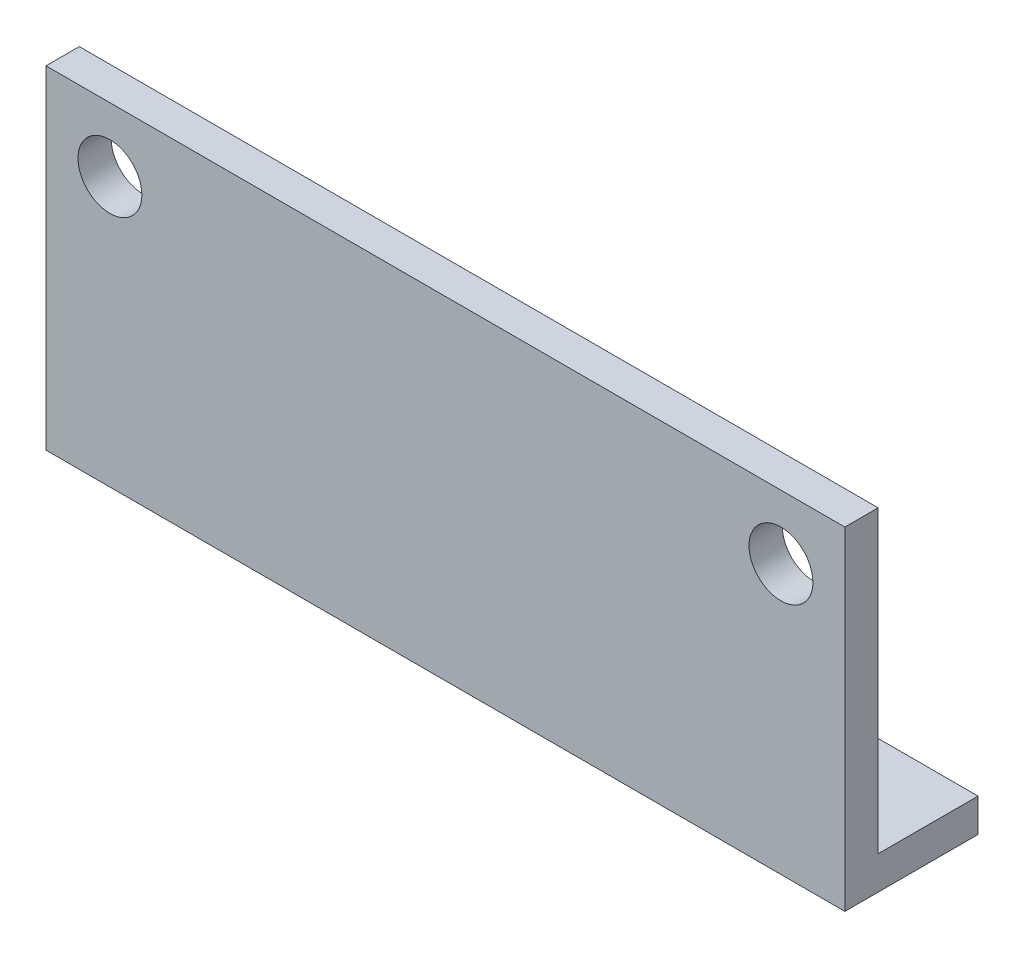
ISO-10303-21;
HEADER;
FILE_DESCRIPTION(('STEP AP214'),'2;1');
FILE_NAME('part.step','',(''),(''),'','','');
FILE_SCHEMA(('AUTOMOTIVE_DESIGN { 1 0 10303 214 1 1 1 1 }'));
ENDSEC;
DATA;
#1=APPLICATION_CONTEXT('core data for automotive mechanical design processes');
#2=APPLICATION_PROTOCOL_DEFINITION('international standard','automotive_design',2000,#1);
#3=PRODUCT_CONTEXT('',#1,'mechanical');
#4=PRODUCT('Part','Part','',(#3));
#5=PRODUCT_RELATED_PRODUCT_CATEGORY('part','',(#4));
#6=PRODUCT_DEFINITION_FORMATION('','',#4);
#7=PRODUCT_DEFINITION_CONTEXT('part definition',#1,'design');
#8=PRODUCT_DEFINITION('design','',#6,#7);
#9=PRODUCT_DEFINITION_SHAPE('','',#8);
#10=(LENGTH_UNIT() NAMED_UNIT(*) SI_UNIT(.MILLI.,.METRE.));
#11=(NAMED_UNIT(*) PLANE_ANGLE_UNIT() SI_UNIT($,.RADIAN.));
#12=(NAMED_UNIT(*) SI_UNIT($,.STERADIAN.) SOLID_ANGLE_UNIT());
#13=UNCERTAINTY_MEASURE_WITH_UNIT(LENGTH_MEASURE(1.E-05),#10,'distance_accuracy_value','');
#14=(GEOMETRIC_REPRESENTATION_CONTEXT(3) GLOBAL_UNCERTAINTY_ASSIGNED_CONTEXT((#13)) GLOBAL_UNIT_ASSIGNED_CONTEXT((#10,
#11,#12)) REPRESENTATION_CONTEXT('',''));
#15=CARTESIAN_POINT('',(0.,0.,0.));
#16=DIRECTION('',(0.,0.,1.));
#17=DIRECTION('',(1.,0.,0.));
#18=AXIS2_PLACEMENT_3D('',#15,#16,#17);
#19=CARTESIAN_POINT('',(150.,12.5,-12.5));
#20=DIRECTION('',(0.,-1.,0.));
#21=DIRECTION('',(0.,0.,-1.));
#22=AXIS2_PLACEMENT_3D('',#19,#20,#21);
#23=PLANE('',#22);
#24=DIRECTION('',(0.,0.,-1.));
#25=VECTOR('',#24,1.);
#26=CARTESIAN_POINT('',(6.25,12.5,-50.));
#27=LINE('',#26,#25);
#28=CARTESIAN_POINT('',(6.25,12.5,-12.5));
#29=VERTEX_POINT('',#28);
#30=CARTESIAN_POINT('',(6.25,12.5,-50.));
#31=VERTEX_POINT('',#30);
#32=EDGE_CURVE('E189',#29,#31,#27,.T.);
#33=ORIENTED_EDGE('',*,*,#32,.F.);
#34=DIRECTION('',(-1.,0.,0.));
#35=VECTOR('',#34,1.);
#36=CARTESIAN_POINT('',(150.,12.5,-12.5));
#37=LINE('',#36,#35);
#38=CARTESIAN_POINT('',(150.,12.5,-12.5));
#39=VERTEX_POINT('',#38);
#40=EDGE_CURVE('E152',#39,#29,#37,.T.);
#41=ORIENTED_EDGE('',*,*,#40,.F.);
#42=DIRECTION('',(0.,0.,1.));
#43=VECTOR('',#42,1.);
#44=CARTESIAN_POINT('',(150.,12.5,-12.5));
#45=LINE('',#44,#43);
#46=CARTESIAN_POINT('',(150.,12.5,-50.));
#47=VERTEX_POINT('',#46);
#48=EDGE_CURVE('E109',#47,#39,#45,.T.);
#49=ORIENTED_EDGE('',*,*,#48,.F.);
#50=DIRECTION('',(-1.,0.,0.));
#51=VECTOR('',#50,1.);
#52=CARTESIAN_POINT('',(150.,12.5,-50.));
#53=LINE('',#52,#51);
#54=EDGE_CURVE('E41',#47,#31,#53,.T.);
#55=ORIENTED_EDGE('',*,*,#54,.T.);
#56=EDGE_LOOP('',(#33,#41,#49,#55));
#57=FACE_BOUND('',#56,.T.);
#58=ADVANCED_FACE('F33',(#57),#23,.F.);
#59=CARTESIAN_POINT('',(150.,125.,-12.5));
#60=DIRECTION('',(0.,0.,1.));
#61=DIRECTION('',(0.,-1.,0.));
#62=AXIS2_PLACEMENT_3D('',#59,#60,#61);
#63=PLANE('',#62);
#64=CARTESIAN_POINT('',(126.,101.,-12.5));
#65=DIRECTION('',(0.,0.,1.));
#66=DIRECTION('',(0.,-1.,0.));
#67=AXIS2_PLACEMENT_3D('',#64,#65,#66);
#68=CIRCLE('',#67,12.);
#69=CARTESIAN_POINT('',(126.,89.,-12.5));
#70=VERTEX_POINT('',#69);
#71=EDGE_CURVE('E216',#70,#70,#68,.T.);
#72=ORIENTED_EDGE('',*,*,#71,.T.);
#73=EDGE_LOOP('',(#72));
#74=FACE_BOUND('',#73,.T.);
#75=DIRECTION('',(0.,-1.,0.));
#76=VECTOR('',#75,1.);
#77=CARTESIAN_POINT('',(6.25,12.5,-12.5));
#78=LINE('',#77,#76);
#79=CARTESIAN_POINT('',(6.25,125.,-12.5));
#80=VERTEX_POINT('',#79);
#81=EDGE_CURVE('E120',#80,#29,#78,.T.);
#82=ORIENTED_EDGE('',*,*,#81,.F.);
#83=DIRECTION('',(-1.,0.,0.));
#84=VECTOR('',#83,1.);
#85=CARTESIAN_POINT('',(150.,125.,-12.5));
#86=LINE('',#85,#84);
#87=CARTESIAN_POINT('',(150.,125.,-12.5));
#88=VERTEX_POINT('',#87);
#89=EDGE_CURVE('E116',#88,#80,#86,.T.);
#90=ORIENTED_EDGE('',*,*,#89,.F.);
#91=DIRECTION('',(0.,1.,0.));
#92=VECTOR('',#91,1.);
#93=CARTESIAN_POINT('',(150.,125.,-12.5));
#94=LINE('',#93,#92);
#95=EDGE_CURVE('E102',#39,#88,#94,.T.);
#96=ORIENTED_EDGE('',*,*,#95,.F.);
#97=ORIENTED_EDGE('',*,*,#40,.T.);
#98=EDGE_LOOP('',(#82,#90,#96,#97));
#99=FACE_BOUND('',#98,.T.);
#100=ADVANCED_FACE('F117',(#74,#99),#63,.F.);
#101=CARTESIAN_POINT('',(150.,0.,-50.));
#102=DIRECTION('',(0.,1.,0.));
#103=DIRECTION('',(0.,0.,1.));
#104=AXIS2_PLACEMENT_3D('',#101,#102,#103);
#105=PLANE('',#104);
#106=DIRECTION('',(0.,0.,-1.));
#107=VECTOR('',#106,1.);
#108=CARTESIAN_POINT('',(-150.,0.,-50.));
#109=LINE('',#108,#107);
#110=CARTESIAN_POINT('',(-150.,0.,0.));
#111=VERTEX_POINT('',#110);
#112=CARTESIAN_POINT('',(-150.,0.,-50.));
#113=VERTEX_POINT('',#112);
#114=EDGE_CURVE('E133',#111,#113,#109,.T.);
#115=ORIENTED_EDGE('',*,*,#114,.T.);
#116=DIRECTION('',(-1.,0.,0.));
#117=VECTOR('',#116,1.);
#118=CARTESIAN_POINT('',(150.,0.,-50.));
#119=LINE('',#118,#117);
#120=CARTESIAN_POINT('',(150.,0.,-50.));
#121=VERTEX_POINT('',#120);
#122=EDGE_CURVE('E11',#121,#113,#119,.T.);
#123=ORIENTED_EDGE('',*,*,#122,.F.);
#124=DIRECTION('',(0.,0.,-1.));
#125=VECTOR('',#124,1.);
#126=CARTESIAN_POINT('',(150.,0.,-50.));
#127=LINE('',#126,#125);
#128=CARTESIAN_POINT('',(150.,0.,0.));
#129=VERTEX_POINT('',#128);
#130=EDGE_CURVE('E149',#129,#121,#127,.T.);
#131=ORIENTED_EDGE('',*,*,#130,.F.);
#132=DIRECTION('',(-1.,0.,0.));
#133=VECTOR('',#132,1.);
#134=CARTESIAN_POINT('',(150.,0.,0.));
#135=LINE('',#134,#133);
#136=EDGE_CURVE('E129',#129,#111,#135,.T.);
#137=ORIENTED_EDGE('',*,*,#136,.T.);
#138=EDGE_LOOP('',(#115,#123,#131,#137));
#139=FACE_BOUND('',#138,.T.);
#140=ADVANCED_FACE('F35',(#139),#105,.F.);
#141=CARTESIAN_POINT('',(150.,12.5,-50.));
#142=DIRECTION('',(0.,0.,1.));
#143=DIRECTION('',(1.,0.,0.));
#144=AXIS2_PLACEMENT_3D('',#141,#142,#143);
#145=PLANE('',#144);
#146=DIRECTION('',(0.,1.,0.));
#147=VECTOR('',#146,1.);
#148=CARTESIAN_POINT('',(-150.,12.5,-50.));
#149=LINE('',#148,#147);
#150=CARTESIAN_POINT('',(-150.,12.5,-50.));
#151=VERTEX_POINT('',#150);
#152=EDGE_CURVE('E136',#113,#151,#149,.T.);
#153=ORIENTED_EDGE('',*,*,#152,.T.);
#154=CARTESIAN_POINT('',(-6.25,12.5,-50.));
#155=VERTEX_POINT('',#154);
#156=EDGE_CURVE('E153',#155,#151,#53,.T.);
#157=ORIENTED_EDGE('',*,*,#156,.F.);
#158=DIRECTION('',(-1.,0.,0.));
#159=VECTOR('',#158,1.);
#160=CARTESIAN_POINT('',(6.25,12.5,-50.));
#161=LINE('',#160,#159);
#162=EDGE_CURVE('E137',#31,#155,#161,.T.);
#163=ORIENTED_EDGE('',*,*,#162,.F.);
#164=ORIENTED_EDGE('',*,*,#54,.F.);
#165=DIRECTION('',(0.,1.,0.));
#166=VECTOR('',#165,1.);
#167=CARTESIAN_POINT('',(150.,12.5,-50.));
#168=LINE('',#167,#166);
#169=EDGE_CURVE('E92',#121,#47,#168,.T.);
#170=ORIENTED_EDGE('',*,*,#169,.F.);
#171=ORIENTED_EDGE('',*,*,#122,.T.);
#172=EDGE_LOOP('',(#153,#157,#163,#164,#170,#171));
#173=FACE_BOUND('',#172,.T.);
#174=ADVANCED_FACE('F168',(#173),#145,.F.);
#175=CARTESIAN_POINT('',(-6.25,12.5,-12.5));
#176=VERTEX_POINT('',#175);
#177=CARTESIAN_POINT('',(-150.,12.5,-12.5));
#178=VERTEX_POINT('',#177);
#179=EDGE_CURVE('E123',#176,#178,#37,.T.);
#180=ORIENTED_EDGE('',*,*,#179,.F.);
#181=DIRECTION('',(0.,0.,-1.));
#182=VECTOR('',#181,1.);
#183=CARTESIAN_POINT('',(-6.25,12.5,-50.));
#184=LINE('',#183,#182);
#185=EDGE_CURVE('E166',#176,#155,#184,.T.);
#186=ORIENTED_EDGE('',*,*,#185,.T.);
#187=ORIENTED_EDGE('',*,*,#156,.T.);
#188=DIRECTION('',(0.,0.,1.));
#189=VECTOR('',#188,1.);
#190=CARTESIAN_POINT('',(-150.,12.5,-12.5));
#191=LINE('',#190,#189);
#192=EDGE_CURVE('E140',#151,#178,#191,.T.);
#193=ORIENTED_EDGE('',*,*,#192,.T.);
#194=EDGE_LOOP('',(#180,#186,#187,#193));
#195=FACE_BOUND('',#194,.T.);
#196=ADVANCED_FACE('F162',(#195),#23,.F.);
#197=CARTESIAN_POINT('',(-126.,101.,-12.5));
#198=DIRECTION('',(0.,0.,1.));
#199=DIRECTION('',(0.,-1.,0.));
#200=AXIS2_PLACEMENT_3D('',#197,#198,#199);
#201=CIRCLE('',#200,12.);
#202=CARTESIAN_POINT('',(-126.,89.,-12.5));
#203=VERTEX_POINT('',#202);
#204=EDGE_CURVE('E204',#203,#203,#201,.F.);
#205=ORIENTED_EDGE('',*,*,#204,.F.);
#206=EDGE_LOOP('',(#205));
#207=FACE_BOUND('',#206,.T.);
#208=CARTESIAN_POINT('',(-6.24999999999999,125.,-12.5));
#209=VERTEX_POINT('',#208);
#210=CARTESIAN_POINT('',(-150.,125.,-12.5));
#211=VERTEX_POINT('',#210);
#212=EDGE_CURVE('E124',#209,#211,#86,.T.);
#213=ORIENTED_EDGE('',*,*,#212,.F.);
#214=DIRECTION('',(0.,-1.,0.));
#215=VECTOR('',#214,1.);
#216=CARTESIAN_POINT('',(-6.25,12.5,-12.5));
#217=LINE('',#216,#215);
#218=EDGE_CURVE('E48',#209,#176,#217,.T.);
#219=ORIENTED_EDGE('',*,*,#218,.T.);
#220=ORIENTED_EDGE('',*,*,#179,.T.);
#221=DIRECTION('',(0.,1.,0.));
#222=VECTOR('',#221,1.);
#223=CARTESIAN_POINT('',(-150.,125.,-12.5));
#224=LINE('',#223,#222);
#225=EDGE_CURVE('E143',#178,#211,#224,.T.);
#226=ORIENTED_EDGE('',*,*,#225,.T.);
#227=EDGE_LOOP('',(#213,#219,#220,#226));
#228=FACE_BOUND('',#227,.T.);
#229=ADVANCED_FACE('F176',(#207,#228),#63,.F.);
#230=CARTESIAN_POINT('',(150.,125.,0.));
#231=DIRECTION('',(0.,-1.,0.));
#232=DIRECTION('',(0.,0.,-1.));
#233=AXIS2_PLACEMENT_3D('',#230,#231,#232);
#234=PLANE('',#233);
#235=DIRECTION('',(0.,0.,1.));
#236=VECTOR('',#235,1.);
#237=CARTESIAN_POINT('',(-150.,125.,0.));
#238=LINE('',#237,#236);
#239=CARTESIAN_POINT('',(-150.,125.,0.));
#240=VERTEX_POINT('',#239);
#241=EDGE_CURVE('E146',#211,#240,#238,.T.);
#242=ORIENTED_EDGE('',*,*,#241,.T.);
#243=DIRECTION('',(-1.,0.,0.));
#244=VECTOR('',#243,1.);
#245=CARTESIAN_POINT('',(150.,125.,0.));
#246=LINE('',#245,#244);
#247=CARTESIAN_POINT('',(150.,125.,0.));
#248=VERTEX_POINT('',#247);
#249=EDGE_CURVE('E127',#248,#240,#246,.T.);
#250=ORIENTED_EDGE('',*,*,#249,.F.);
#251=DIRECTION('',(0.,0.,1.));
#252=VECTOR('',#251,1.);
#253=CARTESIAN_POINT('',(150.,125.,0.));
#254=LINE('',#253,#252);
#255=EDGE_CURVE('E106',#88,#248,#254,.T.);
#256=ORIENTED_EDGE('',*,*,#255,.F.);
#257=ORIENTED_EDGE('',*,*,#89,.T.);
#258=DIRECTION('',(-1.,0.,0.));
#259=VECTOR('',#258,1.);
#260=CARTESIAN_POINT('',(6.25,125.,-12.5));
#261=LINE('',#260,#259);
#262=EDGE_CURVE('E192',#80,#209,#261,.T.);
#263=ORIENTED_EDGE('',*,*,#262,.T.);
#264=ORIENTED_EDGE('',*,*,#212,.T.);
#265=EDGE_LOOP('',(#242,#250,#256,#257,#263,#264));
#266=FACE_BOUND('',#265,.T.);
#267=ADVANCED_FACE('F126',(#266),#234,.F.);
#268=CARTESIAN_POINT('',(150.,0.,0.));
#269=DIRECTION('',(0.,0.,-1.));
#270=DIRECTION('',(-1.,0.,0.));
#271=AXIS2_PLACEMENT_3D('',#268,#269,#270);
#272=PLANE('',#271);
#273=CARTESIAN_POINT('',(126.,101.,0.));
#274=DIRECTION('',(0.,0.,-1.));
#275=DIRECTION('',(-1.,0.,0.));
#276=AXIS2_PLACEMENT_3D('',#273,#274,#275);
#277=CIRCLE('',#276,12.);
#278=CARTESIAN_POINT('',(114.,101.,0.));
#279=VERTEX_POINT('',#278);
#280=EDGE_CURVE('E212',#279,#279,#277,.T.);
#281=ORIENTED_EDGE('',*,*,#280,.T.);
#282=EDGE_LOOP('',(#281));
#283=FACE_BOUND('',#282,.T.);
#284=CARTESIAN_POINT('',(-126.,101.,0.));
#285=DIRECTION('',(0.,0.,1.));
#286=DIRECTION('',(1.,0.,0.));
#287=AXIS2_PLACEMENT_3D('',#284,#285,#286);
#288=CIRCLE('',#287,12.);
#289=CARTESIAN_POINT('',(-114.,101.,0.));
#290=VERTEX_POINT('',#289);
#291=EDGE_CURVE('E208',#290,#290,#288,.T.);
#292=ORIENTED_EDGE('',*,*,#291,.F.);
#293=EDGE_LOOP('',(#292));
#294=FACE_BOUND('',#293,.T.);
#295=DIRECTION('',(0.,-1.,0.));
#296=VECTOR('',#295,1.);
#297=CARTESIAN_POINT('',(-150.,0.,0.));
#298=LINE('',#297,#296);
#299=EDGE_CURVE('E84',#240,#111,#298,.T.);
#300=ORIENTED_EDGE('',*,*,#299,.T.);
#301=ORIENTED_EDGE('',*,*,#136,.F.);
#302=DIRECTION('',(0.,-1.,0.));
#303=VECTOR('',#302,1.);
#304=CARTESIAN_POINT('',(150.,0.,0.));
#305=LINE('',#304,#303);
#306=EDGE_CURVE('E57',#248,#129,#305,.T.);
#307=ORIENTED_EDGE('',*,*,#306,.F.);
#308=ORIENTED_EDGE('',*,*,#249,.T.);
#309=EDGE_LOOP('',(#300,#301,#307,#308));
#310=FACE_BOUND('',#309,.T.);
#311=ADVANCED_FACE('F252',(#283,#294,#310),#272,.F.);
#312=CARTESIAN_POINT('',(150.,0.,0.));
#313=DIRECTION('',(-1.,0.,0.));
#314=DIRECTION('',(0.,0.,1.));
#315=AXIS2_PLACEMENT_3D('',#312,#313,#314);
#316=PLANE('',#315);
#317=ORIENTED_EDGE('',*,*,#130,.T.);
#318=ORIENTED_EDGE('',*,*,#169,.T.);
#319=ORIENTED_EDGE('',*,*,#48,.T.);
#320=ORIENTED_EDGE('',*,*,#95,.T.);
#321=ORIENTED_EDGE('',*,*,#255,.T.);
#322=ORIENTED_EDGE('',*,*,#306,.T.);
#323=EDGE_LOOP('',(#317,#318,#319,#320,#321,#322));
#324=FACE_BOUND('',#323,.T.);
#325=ADVANCED_FACE('F104',(#324),#316,.F.);
#326=CARTESIAN_POINT('',(-150.,0.,0.));
#327=DIRECTION('',(-1.,0.,0.));
#328=DIRECTION('',(0.,0.,1.));
#329=AXIS2_PLACEMENT_3D('',#326,#327,#328);
#330=PLANE('',#329);
#331=ORIENTED_EDGE('',*,*,#114,.F.);
#332=ORIENTED_EDGE('',*,*,#299,.F.);
#333=ORIENTED_EDGE('',*,*,#241,.F.);
#334=ORIENTED_EDGE('',*,*,#225,.F.);
#335=ORIENTED_EDGE('',*,*,#192,.F.);
#336=ORIENTED_EDGE('',*,*,#152,.F.);
#337=EDGE_LOOP('',(#331,#332,#333,#334,#335,#336));
#338=FACE_BOUND('',#337,.T.);
#339=ADVANCED_FACE('F172',(#338),#330,.T.);
#340=CARTESIAN_POINT('',(6.25,125.,-12.5));
#341=DIRECTION('',(0.,-0.316227766016838,0.948683298050514));
#342=DIRECTION('',(0.,-0.948683298050514,-0.316227766016838));
#343=AXIS2_PLACEMENT_3D('',#340,#341,#342);
#344=PLANE('',#343);
#345=DIRECTION('',(0.,0.948683298050514,0.316227766016838));
#346=VECTOR('',#345,1.);
#347=CARTESIAN_POINT('',(-6.25,125.,-12.5));
#348=LINE('',#347,#346);
#349=EDGE_CURVE('E179',#155,#209,#348,.T.);
#350=ORIENTED_EDGE('',*,*,#349,.T.);
#351=ORIENTED_EDGE('',*,*,#262,.F.);
#352=DIRECTION('',(0.,0.948683298050514,0.316227766016838));
#353=VECTOR('',#352,1.);
#354=CARTESIAN_POINT('',(6.25,125.,-12.5));
#355=LINE('',#354,#353);
#356=EDGE_CURVE('E186',#31,#80,#355,.T.);
#357=ORIENTED_EDGE('',*,*,#356,.F.);
#358=ORIENTED_EDGE('',*,*,#162,.T.);
#359=EDGE_LOOP('',(#350,#351,#357,#358));
#360=FACE_BOUND('',#359,.T.);
#361=ADVANCED_FACE('F193',(#360),#344,.F.);
#362=CARTESIAN_POINT('',(6.25,0.,0.));
#363=DIRECTION('',(-1.,0.,0.));
#364=DIRECTION('',(0.,0.,1.));
#365=AXIS2_PLACEMENT_3D('',#362,#363,#364);
#366=PLANE('',#365);
#367=ORIENTED_EDGE('',*,*,#32,.T.);
#368=ORIENTED_EDGE('',*,*,#356,.T.);
#369=ORIENTED_EDGE('',*,*,#81,.T.);
#370=EDGE_LOOP('',(#367,#368,#369));
#371=FACE_BOUND('',#370,.T.);
#372=ADVANCED_FACE('F188',(#371),#366,.F.);
#373=CARTESIAN_POINT('',(-6.25,0.,0.));
#374=DIRECTION('',(-1.,0.,0.));
#375=DIRECTION('',(0.,0.,1.));
#376=AXIS2_PLACEMENT_3D('',#373,#374,#375);
#377=PLANE('',#376);
#378=ORIENTED_EDGE('',*,*,#185,.F.);
#379=ORIENTED_EDGE('',*,*,#218,.F.);
#380=ORIENTED_EDGE('',*,*,#349,.F.);
#381=EDGE_LOOP('',(#378,#379,#380));
#382=FACE_BOUND('',#381,.T.);
#383=ADVANCED_FACE('F231',(#382),#377,.T.);
#384=CARTESIAN_POINT('',(-126.,101.,-51.));
#385=DIRECTION('',(0.,0.,1.));
#386=DIRECTION('',(1.,0.,0.));
#387=AXIS2_PLACEMENT_3D('',#384,#385,#386);
#388=CYLINDRICAL_SURFACE('',#387,12.);
#389=ORIENTED_EDGE('',*,*,#291,.T.);
#390=EDGE_LOOP('',(#389));
#391=FACE_BOUND('',#390,.T.);
#392=ORIENTED_EDGE('',*,*,#204,.T.);
#393=EDGE_LOOP('',(#392));
#394=FACE_BOUND('',#393,.T.);
#395=ADVANCED_FACE('F225',(#391,#394),#388,.F.);
#396=CARTESIAN_POINT('',(126.,101.,-51.));
#397=DIRECTION('',(0.,0.,1.));
#398=DIRECTION('',(1.,0.,0.));
#399=AXIS2_PLACEMENT_3D('',#396,#397,#398);
#400=CYLINDRICAL_SURFACE('',#399,12.);
#401=ORIENTED_EDGE('',*,*,#280,.F.);
#402=EDGE_LOOP('',(#401));
#403=FACE_BOUND('',#402,.T.);
#404=ORIENTED_EDGE('',*,*,#71,.F.);
#405=EDGE_LOOP('',(#404));
#406=FACE_BOUND('',#405,.T.);
#407=ADVANCED_FACE('F223',(#403,#406),#400,.F.);
#408=CLOSED_SHELL('',(#58,#100,#140,#174,#196,#229,#267,#311,#325,#339,#361,#372,#383,#395,#407));
#409=MANIFOLD_SOLID_BREP('B2',#408);
#410=ADVANCED_BREP_SHAPE_REPRESENTATION('',(#18,#409),#14);
#411=SHAPE_DEFINITION_REPRESENTATION(#9,#410);
ENDSEC;
END-ISO-10303-21;
